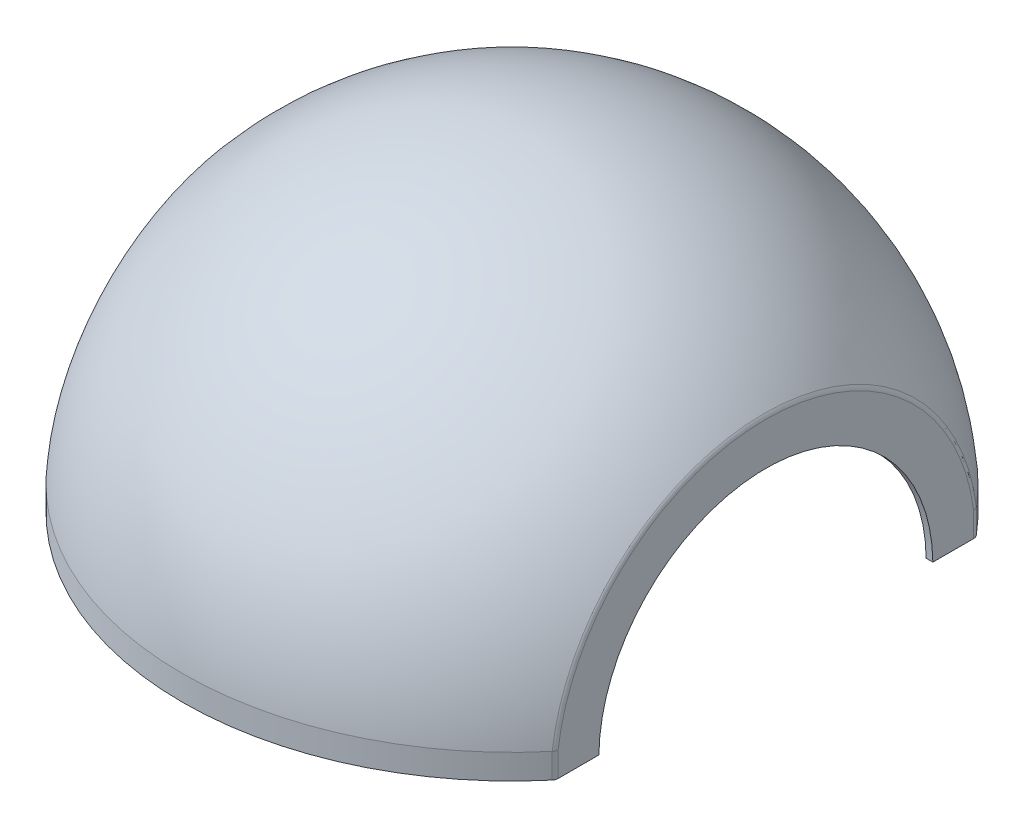
ISO-10303-21;
HEADER;
FILE_DESCRIPTION(('STEP AP214'),'2;1');
FILE_NAME('part.step','',(''),(''),'','','');
FILE_SCHEMA(('AUTOMOTIVE_DESIGN { 1 0 10303 214 1 1 1 1 }'));
ENDSEC;
DATA;
#1=APPLICATION_CONTEXT('core data for automotive mechanical design processes');
#2=APPLICATION_PROTOCOL_DEFINITION('international standard','automotive_design',2000,#1);
#3=PRODUCT_CONTEXT('',#1,'mechanical');
#4=PRODUCT('Part','Part','',(#3));
#5=PRODUCT_RELATED_PRODUCT_CATEGORY('part','',(#4));
#6=PRODUCT_DEFINITION_FORMATION('','',#4);
#7=PRODUCT_DEFINITION_CONTEXT('part definition',#1,'design');
#8=PRODUCT_DEFINITION('design','',#6,#7);
#9=PRODUCT_DEFINITION_SHAPE('','',#8);
#10=(LENGTH_UNIT() NAMED_UNIT(*) SI_UNIT(.MILLI.,.METRE.));
#11=(NAMED_UNIT(*) PLANE_ANGLE_UNIT() SI_UNIT($,.RADIAN.));
#12=(NAMED_UNIT(*) SI_UNIT($,.STERADIAN.) SOLID_ANGLE_UNIT());
#13=UNCERTAINTY_MEASURE_WITH_UNIT(LENGTH_MEASURE(1.E-05),#10,'distance_accuracy_value','');
#14=(GEOMETRIC_REPRESENTATION_CONTEXT(3) GLOBAL_UNCERTAINTY_ASSIGNED_CONTEXT((#13)) GLOBAL_UNIT_ASSIGNED_CONTEXT((#10,
#11,#12)) REPRESENTATION_CONTEXT('',''));
#15=CARTESIAN_POINT('',(0.,0.,0.));
#16=DIRECTION('',(0.,0.,1.));
#17=DIRECTION('',(1.,0.,0.));
#18=AXIS2_PLACEMENT_3D('',#15,#16,#17);
#19=CARTESIAN_POINT('',(145.,1.,0.));
#20=DIRECTION('',(0.,-1.,0.));
#21=DIRECTION('',(0.,0.,-1.));
#22=AXIS2_PLACEMENT_3D('',#19,#20,#21);
#23=PLANE('',#22);
#24=DIRECTION('',(0.,0.,1.));
#25=VECTOR('',#24,1.);
#26=CARTESIAN_POINT('',(114.,1.,0.));
#27=LINE('',#26,#25);
#28=CARTESIAN_POINT('',(114.,1.00000000000001,74.9933330370107));
#29=VERTEX_POINT('',#28);
#30=CARTESIAN_POINT('',(114.,1.,93.2952303175248));
#31=VERTEX_POINT('',#30);
#32=EDGE_CURVE('E289',#29,#31,#27,.T.);
#33=ORIENTED_EDGE('',*,*,#32,.T.);
#34=CARTESIAN_POINT('',(111.,1.,93.2952303175248));
#35=DIRECTION('',(0.,-1.,0.));
#36=DIRECTION('',(0.,0.,-1.));
#37=AXIS2_PLACEMENT_3D('',#34,#35,#36);
#38=CIRCLE('',#37,3.);
#39=CARTESIAN_POINT('',(113.296551724138,1.,95.2254764620253));
#40=VERTEX_POINT('',#39);
#41=EDGE_CURVE('E408',#31,#40,#38,.T.);
#42=ORIENTED_EDGE('',*,*,#41,.T.);
#43=CARTESIAN_POINT('',(0.,1.,0.));
#44=DIRECTION('',(0.,-1.,0.));
#45=DIRECTION('',(0.,0.,-1.));
#46=AXIS2_PLACEMENT_3D('',#43,#44,#45);
#47=CIRCLE('',#46,148.);
#48=CARTESIAN_POINT('',(-113.296551724138,1.,95.2254764620253));
#49=VERTEX_POINT('',#48);
#50=EDGE_CURVE('E303',#40,#49,#47,.T.);
#51=ORIENTED_EDGE('',*,*,#50,.T.);
#52=CARTESIAN_POINT('',(-111.,1.,93.2952303175248));
#53=DIRECTION('',(0.,-1.,0.));
#54=DIRECTION('',(0.,0.,-1.));
#55=AXIS2_PLACEMENT_3D('',#52,#53,#54);
#56=CIRCLE('',#55,3.);
#57=CARTESIAN_POINT('',(-114.,1.,93.2952303175248));
#58=VERTEX_POINT('',#57);
#59=EDGE_CURVE('E406',#49,#58,#56,.T.);
#60=ORIENTED_EDGE('',*,*,#59,.T.);
#61=DIRECTION('',(0.,0.,-1.));
#62=VECTOR('',#61,1.);
#63=CARTESIAN_POINT('',(-114.,1.,0.));
#64=LINE('',#63,#62);
#65=CARTESIAN_POINT('',(-114.,0.99999999999999,74.9933330370107));
#66=VERTEX_POINT('',#65);
#67=EDGE_CURVE('E180',#58,#66,#64,.T.);
#68=ORIENTED_EDGE('',*,*,#67,.T.);
#69=DIRECTION('',(-1.,0.,0.));
#70=VECTOR('',#69,1.);
#71=CARTESIAN_POINT('',(-111.,0.99999999999999,74.9933330370107));
#72=LINE('',#71,#70);
#73=CARTESIAN_POINT('',(-111.,0.99999999999999,74.9933330370107));
#74=VERTEX_POINT('',#73);
#75=EDGE_CURVE('E175',#74,#66,#72,.T.);
#76=ORIENTED_EDGE('',*,*,#75,.F.);
#77=DIRECTION('',(0.,0.,1.));
#78=VECTOR('',#77,1.);
#79=CARTESIAN_POINT('',(-111.,0.99999999999999,74.9933330370107));
#80=LINE('',#79,#78);
#81=CARTESIAN_POINT('',(-111.,1.,93.2952303175248));
#82=VERTEX_POINT('',#81);
#83=EDGE_CURVE('E179',#74,#82,#80,.T.);
#84=ORIENTED_EDGE('',*,*,#83,.T.);
#85=CARTESIAN_POINT('',(0.,1.,0.));
#86=DIRECTION('',(0.,-1.,0.));
#87=DIRECTION('',(0.,0.,-1.));
#88=AXIS2_PLACEMENT_3D('',#85,#86,#87);
#89=CIRCLE('',#88,145.);
#90=CARTESIAN_POINT('',(111.,1.,93.2952303175248));
#91=VERTEX_POINT('',#90);
#92=EDGE_CURVE('E294',#91,#82,#89,.T.);
#93=ORIENTED_EDGE('',*,*,#92,.F.);
#94=DIRECTION('',(0.,0.,-1.));
#95=VECTOR('',#94,1.);
#96=CARTESIAN_POINT('',(111.,1.00000000000001,93.9946807005588));
#97=LINE('',#96,#95);
#98=CARTESIAN_POINT('',(111.,1.00000000000001,74.9933330370107));
#99=VERTEX_POINT('',#98);
#100=EDGE_CURVE('E251',#91,#99,#97,.T.);
#101=ORIENTED_EDGE('',*,*,#100,.T.);
#102=DIRECTION('',(1.,0.,0.));
#103=VECTOR('',#102,1.);
#104=CARTESIAN_POINT('',(111.,1.00000000000001,74.9933330370107));
#105=LINE('',#104,#103);
#106=EDGE_CURVE('E256',#99,#29,#105,.T.);
#107=ORIENTED_EDGE('',*,*,#106,.T.);
#108=EDGE_LOOP('',(#33,#42,#51,#60,#68,#76,#84,#93,#101,#107));
#109=FACE_BOUND('',#108,.T.);
#110=ADVANCED_FACE('F36',(#109),#23,.T.);
#111=CARTESIAN_POINT('',(-113.296551724138,1.,-95.2254764620253));
#112=VERTEX_POINT('',#111);
#113=CARTESIAN_POINT('',(113.296551724138,1.,-95.2254764620253));
#114=VERTEX_POINT('',#113);
#115=EDGE_CURVE('E301',#112,#114,#47,.T.);
#116=ORIENTED_EDGE('',*,*,#115,.T.);
#117=CARTESIAN_POINT('',(111.,1.,-93.2952303175248));
#118=DIRECTION('',(0.,-1.,0.));
#119=DIRECTION('',(0.,0.,-1.));
#120=AXIS2_PLACEMENT_3D('',#117,#118,#119);
#121=CIRCLE('',#120,3.);
#122=CARTESIAN_POINT('',(114.,1.,-93.2952303175248));
#123=VERTEX_POINT('',#122);
#124=EDGE_CURVE('E409',#114,#123,#121,.T.);
#125=ORIENTED_EDGE('',*,*,#124,.T.);
#126=CARTESIAN_POINT('',(114.,1.00000000000001,-74.9933330370107));
#127=VERTEX_POINT('',#126);
#128=EDGE_CURVE('E287',#123,#127,#27,.T.);
#129=ORIENTED_EDGE('',*,*,#128,.T.);
#130=DIRECTION('',(1.,0.,0.));
#131=VECTOR('',#130,1.);
#132=CARTESIAN_POINT('',(111.,1.00000000000001,-74.9933330370107));
#133=LINE('',#132,#131);
#134=CARTESIAN_POINT('',(111.,1.00000000000001,-74.9933330370107));
#135=VERTEX_POINT('',#134);
#136=EDGE_CURVE('E253',#135,#127,#133,.T.);
#137=ORIENTED_EDGE('',*,*,#136,.F.);
#138=DIRECTION('',(0.,0.,-1.));
#139=VECTOR('',#138,1.);
#140=CARTESIAN_POINT('',(111.,1.00000000000001,-74.9933330370107));
#141=LINE('',#140,#139);
#142=CARTESIAN_POINT('',(111.,1.,-93.2952303175248));
#143=VERTEX_POINT('',#142);
#144=EDGE_CURVE('E245',#135,#143,#141,.T.);
#145=ORIENTED_EDGE('',*,*,#144,.T.);
#146=CARTESIAN_POINT('',(-111.,1.,-93.2952303175248));
#147=VERTEX_POINT('',#146);
#148=EDGE_CURVE('E292',#147,#143,#89,.T.);
#149=ORIENTED_EDGE('',*,*,#148,.F.);
#150=DIRECTION('',(0.,0.,1.));
#151=VECTOR('',#150,1.);
#152=CARTESIAN_POINT('',(-111.,0.99999999999999,-93.9946807005588));
#153=LINE('',#152,#151);
#154=CARTESIAN_POINT('',(-111.,0.99999999999999,-74.9933330370107));
#155=VERTEX_POINT('',#154);
#156=EDGE_CURVE('E186',#147,#155,#153,.T.);
#157=ORIENTED_EDGE('',*,*,#156,.T.);
#158=DIRECTION('',(-1.,0.,0.));
#159=VECTOR('',#158,1.);
#160=CARTESIAN_POINT('',(-111.,0.99999999999999,-74.9933330370107));
#161=LINE('',#160,#159);
#162=CARTESIAN_POINT('',(-114.,0.99999999999999,-74.9933330370107));
#163=VERTEX_POINT('',#162);
#164=EDGE_CURVE('E185',#155,#163,#161,.T.);
#165=ORIENTED_EDGE('',*,*,#164,.T.);
#166=CARTESIAN_POINT('',(-114.,1.,-93.2952303175248));
#167=VERTEX_POINT('',#166);
#168=EDGE_CURVE('E291',#163,#167,#64,.T.);
#169=ORIENTED_EDGE('',*,*,#168,.T.);
#170=CARTESIAN_POINT('',(-111.,1.,-93.2952303175248));
#171=DIRECTION('',(0.,-1.,0.));
#172=DIRECTION('',(0.,0.,-1.));
#173=AXIS2_PLACEMENT_3D('',#170,#171,#172);
#174=CIRCLE('',#173,3.);
#175=EDGE_CURVE('E362',#167,#112,#174,.T.);
#176=ORIENTED_EDGE('',*,*,#175,.T.);
#177=EDGE_LOOP('',(#116,#125,#129,#137,#145,#149,#157,#165,#169,#176));
#178=FACE_BOUND('',#177,.T.);
#179=ADVANCED_FACE('F423',(#178),#23,.T.);
#180=CARTESIAN_POINT('',(0.,0.,0.));
#181=DIRECTION('',(0.,-1.,0.));
#182=DIRECTION('',(0.,0.,-1.));
#183=AXIS2_PLACEMENT_3D('',#180,#181,#182);
#184=CYLINDRICAL_SURFACE('',#183,148.);
#185=CARTESIAN_POINT('',(0.,12.1757956618859,0.));
#186=DIRECTION('',(0.,-1.,0.));
#187=DIRECTION('',(0.,0.,-1.));
#188=AXIS2_PLACEMENT_3D('',#185,#186,#187);
#189=CIRCLE('',#188,148.);
#190=CARTESIAN_POINT('',(-113.288659793814,12.1757956618859,-95.234865265413));
#191=VERTEX_POINT('',#190);
#192=CARTESIAN_POINT('',(113.288659793819,12.1757956618859,-95.234865265407));
#193=VERTEX_POINT('',#192);
#194=EDGE_CURVE('E302',#191,#193,#189,.T.);
#195=ORIENTED_EDGE('',*,*,#194,.T.);
#196=CARTESIAN_POINT('',(113.288659793819,12.1757956618859,-95.234865265407));
#197=CARTESIAN_POINT('',(113.289975959251,12.1757957506517,-95.2332995927424));
#198=CARTESIAN_POINT('',(113.291291702827,12.1757709454617,-95.2317343561283));
#199=CARTESIAN_POINT('',(113.293922346267,12.17567154717,-95.2286047550011));
#200=CARTESIAN_POINT('',(113.29523724613,12.1755969540684,-95.227040390488));
#201=CARTESIAN_POINT('',(113.296551724138,12.1754974670109,-95.2254764620253));
#202=B_SPLINE_CURVE_WITH_KNOTS('',3,(#196,#197,#198,#199,#200,#201),.UNSPECIFIED.,.F.,.F.,(4,2,
4),(0.,0.00613480717022669,0.0122696143399743),.UNSPECIFIED.);
#203=CARTESIAN_POINT('',(113.296551724138,12.1754974670111,-95.2254764620253));
#204=VERTEX_POINT('',#203);
#205=EDGE_CURVE('E384',#193,#204,#202,.T.);
#206=ORIENTED_EDGE('',*,*,#205,.T.);
#207=DIRECTION('',(0.,-1.,0.));
#208=VECTOR('',#207,1.);
#209=CARTESIAN_POINT('',(113.296551724138,0.,-95.2254764620253));
#210=LINE('',#209,#208);
#211=EDGE_CURVE('E323',#204,#114,#210,.T.);
#212=ORIENTED_EDGE('',*,*,#211,.T.);
#213=ORIENTED_EDGE('',*,*,#115,.F.);
#214=DIRECTION('',(0.,-1.,0.));
#215=VECTOR('',#214,1.);
#216=CARTESIAN_POINT('',(-113.296551724138,0.,-95.2254764620253));
#217=LINE('',#216,#215);
#218=CARTESIAN_POINT('',(-113.296551724138,12.175497467011,-95.2254764620253));
#219=VERTEX_POINT('',#218);
#220=EDGE_CURVE('E315',#112,#219,#217,.F.);
#221=ORIENTED_EDGE('',*,*,#220,.T.);
#222=CARTESIAN_POINT('',(-113.296551724138,12.175497467011,-95.2254764620253));
#223=CARTESIAN_POINT('',(-113.295237246129,12.1755969540685,-95.227040390489));
#224=CARTESIAN_POINT('',(-113.293922346265,12.1756715471702,-95.2286047550031));
#225=CARTESIAN_POINT('',(-113.291291702824,12.1757709454619,-95.2317343561323));
#226=CARTESIAN_POINT('',(-113.289975959247,12.1757957506519,-95.2332995927474));
#227=CARTESIAN_POINT('',(-113.288659793814,12.1757956618862,-95.234865265413));
#228=B_SPLINE_CURVE_WITH_KNOTS('',3,(#222,#223,#224,#225,#226,#227),.UNSPECIFIED.,.F.,.F.,(4,2,
4),(0.,0.00613480717365093,0.0122696143477866),.UNSPECIFIED.);
#229=EDGE_CURVE('E317',#219,#191,#228,.T.);
#230=ORIENTED_EDGE('',*,*,#229,.T.);
#231=EDGE_LOOP('',(#195,#206,#212,#213,#221,#230));
#232=FACE_BOUND('',#231,.T.);
#233=ADVANCED_FACE('F325',(#232),#184,.T.);
#234=DIRECTION('',(0.,-1.,0.));
#235=VECTOR('',#234,1.);
#236=CARTESIAN_POINT('',(113.296551724138,0.,95.2254764620253));
#237=LINE('',#236,#235);
#238=CARTESIAN_POINT('',(113.296551724138,12.1754974670111,95.2254764620253));
#239=VERTEX_POINT('',#238);
#240=EDGE_CURVE('E352',#40,#239,#237,.F.);
#241=ORIENTED_EDGE('',*,*,#240,.T.);
#242=CARTESIAN_POINT('',(113.296551724138,12.1754974670111,95.2254764620253));
#243=CARTESIAN_POINT('',(113.295237246129,12.1755969540684,95.227040390489));
#244=CARTESIAN_POINT('',(113.293922346265,12.1756715471699,95.2286047550031));
#245=CARTESIAN_POINT('',(113.291291702824,12.1757709454615,95.2317343561323));
#246=CARTESIAN_POINT('',(113.289975959247,12.1757957506516,95.2332995927475));
#247=CARTESIAN_POINT('',(113.288659793814,12.175795661886,95.234865265413));
#248=B_SPLINE_CURVE_WITH_KNOTS('',3,(#242,#243,#244,#245,#246,#247),.UNSPECIFIED.,.F.,.F.,(4,2,
4),(0.,0.00613480717366456,0.0122696143477914),.UNSPECIFIED.);
#249=CARTESIAN_POINT('',(113.288659793814,12.1757956618859,95.234865265413));
#250=VERTEX_POINT('',#249);
#251=EDGE_CURVE('E356',#239,#250,#248,.T.);
#252=ORIENTED_EDGE('',*,*,#251,.T.);
#253=CARTESIAN_POINT('',(-113.288659793819,12.1757956618859,95.234865265407));
#254=VERTEX_POINT('',#253);
#255=EDGE_CURVE('E298',#250,#254,#189,.T.);
#256=ORIENTED_EDGE('',*,*,#255,.T.);
#257=CARTESIAN_POINT('',(-113.288659793819,12.1757956618859,95.234865265407));
#258=CARTESIAN_POINT('',(-113.289975959251,12.1757957506517,95.2332995927424));
#259=CARTESIAN_POINT('',(-113.291291702827,12.1757709454617,95.2317343561283));
#260=CARTESIAN_POINT('',(-113.293922346267,12.17567154717,95.2286047550011));
#261=CARTESIAN_POINT('',(-113.29523724613,12.1755969540684,95.227040390488));
#262=CARTESIAN_POINT('',(-113.296551724138,12.175497467011,95.2254764620253));
#263=B_SPLINE_CURVE_WITH_KNOTS('',3,(#257,#258,#259,#260,#261,#262),.UNSPECIFIED.,.F.,.F.,(4,2,
4),(0.,0.00613480717021556,0.0122696143399634),.UNSPECIFIED.);
#264=CARTESIAN_POINT('',(-113.296551724138,12.175497467011,95.2254764620253));
#265=VERTEX_POINT('',#264);
#266=EDGE_CURVE('E346',#254,#265,#263,.T.);
#267=ORIENTED_EDGE('',*,*,#266,.T.);
#268=DIRECTION('',(0.,-1.,0.));
#269=VECTOR('',#268,1.);
#270=CARTESIAN_POINT('',(-113.296551724138,0.,95.2254764620253));
#271=LINE('',#270,#269);
#272=EDGE_CURVE('E353',#265,#49,#271,.T.);
#273=ORIENTED_EDGE('',*,*,#272,.T.);
#274=ORIENTED_EDGE('',*,*,#50,.F.);
#275=EDGE_LOOP('',(#241,#252,#256,#267,#273,#274));
#276=FACE_BOUND('',#275,.T.);
#277=ADVANCED_FACE('F400',(#276),#184,.T.);
#278=CARTESIAN_POINT('',(0.,0.,0.));
#279=DIRECTION('',(0.,-1.,0.));
#280=DIRECTION('',(1.,0.,0.));
#281=AXIS2_PLACEMENT_3D('',#278,#279,#280);
#282=SPHERICAL_SURFACE('',#281,148.5);
#283=ORIENTED_EDGE('',*,*,#255,.F.);
#284=CARTESIAN_POINT('',(113.288659793814,0.,0.));
#285=DIRECTION('',(-1.,0.,0.));
#286=DIRECTION('',(0.,-1.,0.));
#287=AXIS2_PLACEMENT_3D('',#284,#285,#286);
#288=CIRCLE('',#287,96.0100492767365);
#289=EDGE_CURVE('E312',#250,#193,#288,.T.);
#290=ORIENTED_EDGE('',*,*,#289,.T.);
#291=ORIENTED_EDGE('',*,*,#194,.F.);
#292=CARTESIAN_POINT('',(-113.288659793814,0.,0.));
#293=DIRECTION('',(1.,0.,0.));
#294=DIRECTION('',(0.,1.,0.));
#295=AXIS2_PLACEMENT_3D('',#292,#293,#294);
#296=CIRCLE('',#295,96.0100492767365);
#297=EDGE_CURVE('E309',#191,#254,#296,.T.);
#298=ORIENTED_EDGE('',*,*,#297,.T.);
#299=EDGE_LOOP('',(#283,#290,#291,#298));
#300=FACE_BOUND('',#299,.T.);
#301=ADVANCED_FACE('F439',(#300),#282,.T.);
#302=CARTESIAN_POINT('',(0.,0.,0.));
#303=DIRECTION('',(0.,-1.,0.));
#304=DIRECTION('',(-1.,0.,0.));
#305=AXIS2_PLACEMENT_3D('',#302,#303,#304);
#306=SPHERICAL_SURFACE('',#305,145.5);
#307=CARTESIAN_POINT('',(-111.059668647084,0.,0.));
#308=DIRECTION('',(1.,0.,0.));
#309=DIRECTION('',(0.,1.,0.));
#310=AXIS2_PLACEMENT_3D('',#307,#308,#309);
#311=CIRCLE('',#310,94.);
#312=CARTESIAN_POINT('',(-111.059668647084,12.051970793194,-93.2241921391652));
#313=VERTEX_POINT('',#312);
#314=CARTESIAN_POINT('',(-111.059668647084,12.051970793194,93.2241921391652));
#315=VERTEX_POINT('',#314);
#316=EDGE_CURVE('E219',#313,#315,#311,.T.);
#317=ORIENTED_EDGE('',*,*,#316,.F.);
#318=CARTESIAN_POINT('',(0.,12.051970793194,0.));
#319=DIRECTION('',(0.,-1.,0.));
#320=DIRECTION('',(0.,0.,-1.));
#321=AXIS2_PLACEMENT_3D('',#318,#319,#320);
#322=CIRCLE('',#321,145.);
#323=CARTESIAN_POINT('',(111.059668647084,12.051970793194,-93.2241921391652));
#324=VERTEX_POINT('',#323);
#325=EDGE_CURVE('E295',#313,#324,#322,.T.);
#326=ORIENTED_EDGE('',*,*,#325,.T.);
#327=CARTESIAN_POINT('',(111.059668647084,0.,0.));
#328=DIRECTION('',(-1.,0.,0.));
#329=DIRECTION('',(0.,-1.,0.));
#330=AXIS2_PLACEMENT_3D('',#327,#328,#329);
#331=CIRCLE('',#330,94.);
#332=CARTESIAN_POINT('',(111.059668647084,12.051970793194,93.2241921391652));
#333=VERTEX_POINT('',#332);
#334=EDGE_CURVE('E268',#333,#324,#331,.T.);
#335=ORIENTED_EDGE('',*,*,#334,.F.);
#336=EDGE_CURVE('E297',#333,#315,#322,.T.);
#337=ORIENTED_EDGE('',*,*,#336,.T.);
#338=EDGE_LOOP('',(#317,#326,#335,#337));
#339=FACE_BOUND('',#338,.T.);
#340=ADVANCED_FACE('F447',(#339),#306,.F.);
#341=CARTESIAN_POINT('',(0.,0.,0.));
#342=DIRECTION('',(0.,-1.,0.));
#343=DIRECTION('',(0.,0.,-1.));
#344=AXIS2_PLACEMENT_3D('',#341,#342,#343);
#345=CYLINDRICAL_SURFACE('',#344,145.);
#346=CARTESIAN_POINT('',(-111.,11.4891252930762,-93.2952303175248));
#347=CARTESIAN_POINT('',(-111.00971599462,11.5829924773327,-93.2836706834026));
#348=CARTESIAN_POINT('',(-111.019546379186,11.6768298611374,-93.2719710181449));
#349=CARTESIAN_POINT('',(-111.039435928214,11.8644450278433,-93.2482916253584));
#350=CARTESIAN_POINT('',(-111.049495092675,11.9582228107445,-93.2363118978296));
#351=CARTESIAN_POINT('',(-111.059668647084,12.0519707931939,-93.2241921391653));
#352=B_SPLINE_CURVE_WITH_KNOTS('',3,(#346,#347,#348,#349,#350,#351),.UNSPECIFIED.,.F.,.F.,(4,2,
4),(0.,0.285220544569754,0.570441089139504),.UNSPECIFIED.);
#353=CARTESIAN_POINT('',(-111.,11.4891252930762,-93.2952303175248));
#354=VERTEX_POINT('',#353);
#355=EDGE_CURVE('E233',#354,#313,#352,.T.);
#356=ORIENTED_EDGE('',*,*,#355,.F.);
#357=DIRECTION('',(0.,-1.,0.));
#358=VECTOR('',#357,1.);
#359=CARTESIAN_POINT('',(-111.,0.,-93.2952303175248));
#360=LINE('',#359,#358);
#361=EDGE_CURVE('E239',#354,#147,#360,.T.);
#362=ORIENTED_EDGE('',*,*,#361,.T.);
#363=ORIENTED_EDGE('',*,*,#148,.T.);
#364=DIRECTION('',(0.,-1.,0.));
#365=VECTOR('',#364,1.);
#366=CARTESIAN_POINT('',(111.,0.,-93.2952303175248));
#367=LINE('',#366,#365);
#368=CARTESIAN_POINT('',(111.,11.4891252930762,-93.2952303175248));
#369=VERTEX_POINT('',#368);
#370=EDGE_CURVE('E285',#143,#369,#367,.F.);
#371=ORIENTED_EDGE('',*,*,#370,.T.);
#372=CARTESIAN_POINT('',(114.,28.4077454226836,-89.6046873773911));
#373=CARTESIAN_POINT('',(113.660257440479,27.044641273684,-90.0368762603402));
#374=CARTESIAN_POINT('',(113.33998637383,25.6671133677272,-90.439329368361));
#375=CARTESIAN_POINT('',(112.743757415266,22.8906795166254,-91.1815416264126));
#376=CARTESIAN_POINT('',(112.467663842771,21.491854063938,-91.5214932335773));
#377=CARTESIAN_POINT('',(111.962962328555,18.6716363681203,-92.1382302669922));
#378=CARTESIAN_POINT('',(111.734357028271,17.2502428744205,-92.4150121796438));
#379=CARTESIAN_POINT('',(111.42967983211,15.102263993429,-92.7817423693542));
#380=CARTESIAN_POINT('',(111.334370132355,14.3824515988266,-92.8960567278873));
#381=CARTESIAN_POINT('',(111.157083846242,12.93873237106,-93.1081177050722));
#382=CARTESIAN_POINT('',(111.075107707008,12.2148254014311,-93.2058637681302));
#383=CARTESIAN_POINT('',(111.,11.4891252930762,-93.2952303175248));
#384=B_SPLINE_CURVE_WITH_KNOTS('',3,(#372,#373,#374,#375,#376,#377,#378,#379,#380,#381,#382,
#383),.UNSPECIFIED.,.F.,.F.,(4,2,2,2,2,4),(0.,4.40902732189413,8.80424209043425,
13.1997012682419,15.4045392610895,17.609451175364),.UNSPECIFIED.);
#385=EDGE_CURVE('E279',#324,#369,#384,.T.);
#386=ORIENTED_EDGE('',*,*,#385,.F.);
#387=ORIENTED_EDGE('',*,*,#325,.F.);
#388=EDGE_LOOP('',(#356,#362,#363,#371,#386,#387));
#389=FACE_BOUND('',#388,.T.);
#390=ADVANCED_FACE('F221',(#389),#345,.F.);
#391=CARTESIAN_POINT('',(-114.,28.4077454226836,89.6046873773911));
#392=CARTESIAN_POINT('',(-113.660257440479,27.044641273684,90.0368762603402));
#393=CARTESIAN_POINT('',(-113.33998637383,25.6671133677271,90.439329368361));
#394=CARTESIAN_POINT('',(-112.743757415266,22.8906795166254,91.1815416264126));
#395=CARTESIAN_POINT('',(-112.467663842771,21.491854063938,91.5214932335773));
#396=CARTESIAN_POINT('',(-111.962962328555,18.6716363681203,92.1382302669922));
#397=CARTESIAN_POINT('',(-111.734357028271,17.2502428744205,92.4150121796438));
#398=CARTESIAN_POINT('',(-111.42967983211,15.102263993429,92.7817423693542));
#399=CARTESIAN_POINT('',(-111.334370132355,14.3824515988266,92.8960567278873));
#400=CARTESIAN_POINT('',(-111.157083846242,12.93873237106,93.1081177050722));
#401=CARTESIAN_POINT('',(-111.075107707008,12.2148254014311,93.2058637681302));
#402=CARTESIAN_POINT('',(-111.,11.4891252930762,93.2952303175248));
#403=B_SPLINE_CURVE_WITH_KNOTS('',3,(#391,#392,#393,#394,#395,#396,#397,#398,#399,#400,#401,
#402),.UNSPECIFIED.,.F.,.F.,(4,2,2,2,2,4),(0.,4.40902732189413,8.80424209043425,
13.1997012682419,15.4045392610895,17.609451175364),.UNSPECIFIED.);
#404=CARTESIAN_POINT('',(-111.,11.4891252930762,93.2952303175248));
#405=VERTEX_POINT('',#404);
#406=EDGE_CURVE('E210',#315,#405,#403,.T.);
#407=ORIENTED_EDGE('',*,*,#406,.F.);
#408=ORIENTED_EDGE('',*,*,#336,.F.);
#409=CARTESIAN_POINT('',(111.,11.4891252930762,93.2952303175248));
#410=CARTESIAN_POINT('',(111.00971599462,11.5829924773327,93.2836706834026));
#411=CARTESIAN_POINT('',(111.019546379186,11.6768298611374,93.2719710181449));
#412=CARTESIAN_POINT('',(111.039435928214,11.8644450278433,93.2482916253584));
#413=CARTESIAN_POINT('',(111.049495092675,11.9582228107445,93.2363118978296));
#414=CARTESIAN_POINT('',(111.059668647084,12.051970793194,93.2241921391653));
#415=B_SPLINE_CURVE_WITH_KNOTS('',3,(#409,#410,#411,#412,#413,#414),.UNSPECIFIED.,.F.,.F.,(4,2,
4),(0.,0.285220544569754,0.570441089139504),.UNSPECIFIED.);
#416=CARTESIAN_POINT('',(111.,11.4891252930762,93.2952303175248));
#417=VERTEX_POINT('',#416);
#418=EDGE_CURVE('E259',#417,#333,#415,.T.);
#419=ORIENTED_EDGE('',*,*,#418,.F.);
#420=DIRECTION('',(0.,-1.,0.));
#421=VECTOR('',#420,1.);
#422=CARTESIAN_POINT('',(111.,0.,93.2952303175248));
#423=LINE('',#422,#421);
#424=EDGE_CURVE('E306',#417,#91,#423,.T.);
#425=ORIENTED_EDGE('',*,*,#424,.T.);
#426=ORIENTED_EDGE('',*,*,#92,.T.);
#427=DIRECTION('',(0.,-1.,0.));
#428=VECTOR('',#427,1.);
#429=CARTESIAN_POINT('',(-111.,0.,93.2952303175248));
#430=LINE('',#429,#428);
#431=EDGE_CURVE('E196',#82,#405,#430,.F.);
#432=ORIENTED_EDGE('',*,*,#431,.T.);
#433=EDGE_LOOP('',(#407,#408,#419,#425,#426,#432));
#434=FACE_BOUND('',#433,.T.);
#435=ADVANCED_FACE('F461',(#434),#345,.F.);
#436=CARTESIAN_POINT('',(114.,150.,-150.));
#437=DIRECTION('',(1.,0.,0.));
#438=DIRECTION('',(0.,1.,0.));
#439=AXIS2_PLACEMENT_3D('',#436,#437,#438);
#440=PLANE('',#439);
#441=ORIENTED_EDGE('',*,*,#128,.F.);
#442=DIRECTION('',(0.,-1.,0.));
#443=VECTOR('',#442,1.);
#444=CARTESIAN_POINT('',(114.,150.,-93.2952303175248));
#445=LINE('',#444,#443);
#446=CARTESIAN_POINT('',(114.,12.0519707931941,-93.2952303175248));
#447=VERTEX_POINT('',#446);
#448=EDGE_CURVE('E392',#123,#447,#445,.F.);
#449=ORIENTED_EDGE('',*,*,#448,.T.);
#450=CARTESIAN_POINT('',(114.,0.,0.));
#451=DIRECTION('',(1.,0.,0.));
#452=DIRECTION('',(0.,1.,0.));
#453=AXIS2_PLACEMENT_3D('',#450,#451,#452);
#454=CIRCLE('',#453,94.0704523216509);
#455=CARTESIAN_POINT('',(114.,12.051970793194,93.2952303175248));
#456=VERTEX_POINT('',#455);
#457=EDGE_CURVE('E391',#447,#456,#454,.T.);
#458=ORIENTED_EDGE('',*,*,#457,.T.);
#459=DIRECTION('',(0.,-1.,0.));
#460=VECTOR('',#459,1.);
#461=CARTESIAN_POINT('',(114.,150.,93.2952303175248));
#462=LINE('',#461,#460);
#463=EDGE_CURVE('E389',#456,#31,#462,.T.);
#464=ORIENTED_EDGE('',*,*,#463,.T.);
#465=ORIENTED_EDGE('',*,*,#32,.F.);
#466=CARTESIAN_POINT('',(114.,0.,0.));
#467=DIRECTION('',(-1.,0.,0.));
#468=DIRECTION('',(0.,1.,0.));
#469=AXIS2_PLACEMENT_3D('',#466,#467,#468);
#470=CIRCLE('',#469,75.);
#471=EDGE_CURVE('E241',#29,#127,#470,.T.);
#472=ORIENTED_EDGE('',*,*,#471,.T.);
#473=EDGE_LOOP('',(#441,#449,#458,#464,#465,#472));
#474=FACE_BOUND('',#473,.T.);
#475=ADVANCED_FACE('F467',(#474),#440,.T.);
#476=CARTESIAN_POINT('',(-114.,150.,-150.));
#477=DIRECTION('',(-1.,0.,0.));
#478=DIRECTION('',(0.,-1.,0.));
#479=AXIS2_PLACEMENT_3D('',#476,#477,#478);
#480=PLANE('',#479);
#481=ORIENTED_EDGE('',*,*,#67,.F.);
#482=DIRECTION('',(0.,-1.,0.));
#483=VECTOR('',#482,1.);
#484=CARTESIAN_POINT('',(-114.,150.,93.2952303175248));
#485=LINE('',#484,#483);
#486=CARTESIAN_POINT('',(-114.,12.051970793194,93.2952303175248));
#487=VERTEX_POINT('',#486);
#488=EDGE_CURVE('E12',#58,#487,#485,.F.);
#489=ORIENTED_EDGE('',*,*,#488,.T.);
#490=CARTESIAN_POINT('',(-114.,0.,0.));
#491=DIRECTION('',(-1.,0.,0.));
#492=DIRECTION('',(0.,-1.,0.));
#493=AXIS2_PLACEMENT_3D('',#490,#491,#492);
#494=CIRCLE('',#493,94.0704523216509);
#495=CARTESIAN_POINT('',(-114.,12.051970793194,-93.2952303175248));
#496=VERTEX_POINT('',#495);
#497=EDGE_CURVE('E49',#487,#496,#494,.T.);
#498=ORIENTED_EDGE('',*,*,#497,.T.);
#499=DIRECTION('',(0.,-1.,0.));
#500=VECTOR('',#499,1.);
#501=CARTESIAN_POINT('',(-114.,150.,-93.2952303175248));
#502=LINE('',#501,#500);
#503=EDGE_CURVE('E411',#496,#167,#502,.T.);
#504=ORIENTED_EDGE('',*,*,#503,.T.);
#505=ORIENTED_EDGE('',*,*,#168,.F.);
#506=CARTESIAN_POINT('',(-114.,0.,0.));
#507=DIRECTION('',(1.,0.,0.));
#508=DIRECTION('',(0.,-1.,0.));
#509=AXIS2_PLACEMENT_3D('',#506,#507,#508);
#510=CIRCLE('',#509,75.);
#511=EDGE_CURVE('E202',#163,#66,#510,.T.);
#512=ORIENTED_EDGE('',*,*,#511,.T.);
#513=EDGE_LOOP('',(#481,#489,#498,#504,#505,#512));
#514=FACE_BOUND('',#513,.T.);
#515=ADVANCED_FACE('F416',(#514),#480,.T.);
#516=CARTESIAN_POINT('',(111.,0.,0.));
#517=DIRECTION('',(1.,0.,0.));
#518=DIRECTION('',(0.,1.,0.));
#519=AXIS2_PLACEMENT_3D('',#516,#517,#518);
#520=CYLINDRICAL_SURFACE('',#519,75.);
#521=ORIENTED_EDGE('',*,*,#471,.F.);
#522=ORIENTED_EDGE('',*,*,#106,.F.);
#523=CARTESIAN_POINT('',(111.,0.,0.));
#524=DIRECTION('',(-1.,0.,0.));
#525=DIRECTION('',(0.,1.,0.));
#526=AXIS2_PLACEMENT_3D('',#523,#524,#525);
#527=CIRCLE('',#526,75.);
#528=EDGE_CURVE('E242',#99,#135,#527,.T.);
#529=ORIENTED_EDGE('',*,*,#528,.T.);
#530=ORIENTED_EDGE('',*,*,#136,.T.);
#531=EDGE_LOOP('',(#521,#522,#529,#530));
#532=FACE_BOUND('',#531,.T.);
#533=ADVANCED_FACE('F275',(#532),#520,.F.);
#534=CARTESIAN_POINT('',(111.,0.,0.));
#535=DIRECTION('',(1.,0.,0.));
#536=DIRECTION('',(0.,1.,0.));
#537=AXIS2_PLACEMENT_3D('',#534,#535,#536);
#538=CYLINDRICAL_SURFACE('',#537,94.);
#539=ORIENTED_EDGE('',*,*,#334,.T.);
#540=ORIENTED_EDGE('',*,*,#385,.T.);
#541=CARTESIAN_POINT('',(111.,0.,0.));
#542=DIRECTION('',(1.,0.,0.));
#543=DIRECTION('',(0.,1.,0.));
#544=AXIS2_PLACEMENT_3D('',#541,#542,#543);
#545=CIRCLE('',#544,94.);
#546=EDGE_CURVE('E248',#369,#417,#545,.T.);
#547=ORIENTED_EDGE('',*,*,#546,.T.);
#548=ORIENTED_EDGE('',*,*,#418,.T.);
#549=EDGE_LOOP('',(#539,#540,#547,#548));
#550=FACE_BOUND('',#549,.T.);
#551=ADVANCED_FACE('F270',(#550),#538,.T.);
#552=CARTESIAN_POINT('',(111.,0.,0.));
#553=DIRECTION('',(1.,0.,0.));
#554=DIRECTION('',(0.,1.,0.));
#555=AXIS2_PLACEMENT_3D('',#552,#553,#554);
#556=PLANE('',#555);
#557=ORIENTED_EDGE('',*,*,#370,.F.);
#558=ORIENTED_EDGE('',*,*,#144,.F.);
#559=ORIENTED_EDGE('',*,*,#528,.F.);
#560=ORIENTED_EDGE('',*,*,#100,.F.);
#561=ORIENTED_EDGE('',*,*,#424,.F.);
#562=ORIENTED_EDGE('',*,*,#546,.F.);
#563=EDGE_LOOP('',(#557,#558,#559,#560,#561,#562));
#564=FACE_BOUND('',#563,.T.);
#565=ADVANCED_FACE('F274',(#564),#556,.F.);
#566=CARTESIAN_POINT('',(-111.,0.,0.));
#567=DIRECTION('',(-1.,0.,0.));
#568=DIRECTION('',(0.,-1.,0.));
#569=AXIS2_PLACEMENT_3D('',#566,#567,#568);
#570=CYLINDRICAL_SURFACE('',#569,75.);
#571=ORIENTED_EDGE('',*,*,#511,.F.);
#572=ORIENTED_EDGE('',*,*,#164,.F.);
#573=CARTESIAN_POINT('',(-111.,0.,0.));
#574=DIRECTION('',(1.,0.,0.));
#575=DIRECTION('',(0.,-1.,0.));
#576=AXIS2_PLACEMENT_3D('',#573,#574,#575);
#577=CIRCLE('',#576,75.);
#578=EDGE_CURVE('E194',#155,#74,#577,.T.);
#579=ORIENTED_EDGE('',*,*,#578,.T.);
#580=ORIENTED_EDGE('',*,*,#75,.T.);
#581=EDGE_LOOP('',(#571,#572,#579,#580));
#582=FACE_BOUND('',#581,.T.);
#583=ADVANCED_FACE('F200',(#582),#570,.F.);
#584=CARTESIAN_POINT('',(-111.,0.,0.));
#585=DIRECTION('',(-1.,0.,0.));
#586=DIRECTION('',(0.,-1.,0.));
#587=AXIS2_PLACEMENT_3D('',#584,#585,#586);
#588=CYLINDRICAL_SURFACE('',#587,94.);
#589=CARTESIAN_POINT('',(-111.,0.,0.));
#590=DIRECTION('',(-1.,0.,0.));
#591=DIRECTION('',(0.,-1.,0.));
#592=AXIS2_PLACEMENT_3D('',#589,#590,#591);
#593=CIRCLE('',#592,94.);
#594=EDGE_CURVE('E197',#405,#354,#593,.T.);
#595=ORIENTED_EDGE('',*,*,#594,.T.);
#596=ORIENTED_EDGE('',*,*,#355,.T.);
#597=ORIENTED_EDGE('',*,*,#316,.T.);
#598=ORIENTED_EDGE('',*,*,#406,.T.);
#599=EDGE_LOOP('',(#595,#596,#597,#598));
#600=FACE_BOUND('',#599,.T.);
#601=ADVANCED_FACE('F225',(#600),#588,.T.);
#602=CARTESIAN_POINT('',(-111.,0.,0.));
#603=DIRECTION('',(-1.,0.,0.));
#604=DIRECTION('',(0.,-1.,0.));
#605=AXIS2_PLACEMENT_3D('',#602,#603,#604);
#606=PLANE('',#605);
#607=ORIENTED_EDGE('',*,*,#361,.F.);
#608=ORIENTED_EDGE('',*,*,#594,.F.);
#609=ORIENTED_EDGE('',*,*,#431,.F.);
#610=ORIENTED_EDGE('',*,*,#83,.F.);
#611=ORIENTED_EDGE('',*,*,#578,.F.);
#612=ORIENTED_EDGE('',*,*,#156,.F.);
#613=EDGE_LOOP('',(#607,#608,#609,#610,#611,#612));
#614=FACE_BOUND('',#613,.T.);
#615=ADVANCED_FACE('F192',(#614),#606,.F.);
#616=CARTESIAN_POINT('',(111.,0.,93.2952303175248));
#617=DIRECTION('',(0.,-1.,0.));
#618=DIRECTION('',(0.,0.,-1.));
#619=AXIS2_PLACEMENT_3D('',#616,#617,#618);
#620=CYLINDRICAL_SURFACE('',#619,3.);
#621=ORIENTED_EDGE('',*,*,#41,.F.);
#622=ORIENTED_EDGE('',*,*,#463,.F.);
#623=CARTESIAN_POINT('',(113.296551724138,12.1754974670111,95.2254764620253));
#624=CARTESIAN_POINT('',(113.350849677009,12.1713850224073,95.1608869389899));
#625=CARTESIAN_POINT('',(113.402402699354,12.1671245147906,95.0940050944363));
#626=CARTESIAN_POINT('',(113.499687734033,12.1583381874931,94.9561534152429));
#627=CARTESIAN_POINT('',(113.545419936769,12.1538123764977,94.8851837144292));
#628=CARTESIAN_POINT('',(113.630845967799,12.144513989594,94.7394607210061));
#629=CARTESIAN_POINT('',(113.670523893432,12.1397408064726,94.6646981286524));
#630=CARTESIAN_POINT('',(113.743415159748,12.1299937667417,94.5121236428166));
#631=CARTESIAN_POINT('',(113.776628688367,12.125019915971,94.434311838062));
#632=CARTESIAN_POINT('',(113.868572248275,12.1094467389557,94.1908384719274));
#633=CARTESIAN_POINT('',(113.916228015895,12.0985614288248,94.0208712369062));
#634=CARTESIAN_POINT('',(113.980917169609,12.076429849926,93.6757897210322));
#635=CARTESIAN_POINT('',(113.99806000564,12.0651850191728,93.5006961359224));
#636=CARTESIAN_POINT('',(113.999948397789,12.0532803807607,93.3155906099527));
#637=CARTESIAN_POINT('',(114.000000234874,12.0526255763602,93.3054098778532));
#638=CARTESIAN_POINT('',(114.,12.051970793194,93.2952303175248));
#639=B_SPLINE_CURVE_WITH_KNOTS('',3,(#623,#624,#625,#626,#627,#628,#629,#630,#631,#632,#633,
#634,#635,#636,#637,#638),.UNSPECIFIED.,.F.,.F.,(4,2,2,2,2,2,2,4),(0.,0.253359336248534,
0.506710382864084,0.760715852182057,1.01471393579592,1.54243455077125,2.06825838695266,
2.09886348727191),.UNSPECIFIED.);
#640=EDGE_CURVE('E204',#239,#456,#639,.T.);
#641=ORIENTED_EDGE('',*,*,#640,.F.);
#642=ORIENTED_EDGE('',*,*,#240,.F.);
#643=EDGE_LOOP('',(#621,#622,#641,#642));
#644=FACE_BOUND('',#643,.T.);
#645=ADVANCED_FACE('F371',(#644),#620,.T.);
#646=CARTESIAN_POINT('',(111.,0.,-93.2952303175248));
#647=DIRECTION('',(0.,-1.,0.));
#648=DIRECTION('',(0.,0.,-1.));
#649=AXIS2_PLACEMENT_3D('',#646,#647,#648);
#650=CYLINDRICAL_SURFACE('',#649,3.);
#651=ORIENTED_EDGE('',*,*,#124,.F.);
#652=ORIENTED_EDGE('',*,*,#211,.F.);
#653=CARTESIAN_POINT('',(113.296551724138,12.1754974670111,-95.2254764620253));
#654=CARTESIAN_POINT('',(113.350849677009,12.1713850224072,-95.1608869389899));
#655=CARTESIAN_POINT('',(113.402402699354,12.1671245147905,-95.0940050944363));
#656=CARTESIAN_POINT('',(113.499687734033,12.1583381874932,-94.9561534152429));
#657=CARTESIAN_POINT('',(113.545419936769,12.1538123764978,-94.8851837144291));
#658=CARTESIAN_POINT('',(113.630845967799,12.144513989594,-94.739460721006));
#659=CARTESIAN_POINT('',(113.670523893432,12.1397408064726,-94.6646981286524));
#660=CARTESIAN_POINT('',(113.743415159748,12.1299937667416,-94.5121236428165));
#661=CARTESIAN_POINT('',(113.776628688368,12.125019915971,-94.434311838062));
#662=CARTESIAN_POINT('',(113.868572248276,12.1094467389557,-94.1908384719274));
#663=CARTESIAN_POINT('',(113.916228015895,12.0985614288247,-94.0208712369061));
#664=CARTESIAN_POINT('',(113.980917169609,12.076429849926,-93.6757897210322));
#665=CARTESIAN_POINT('',(113.99806000564,12.065185019173,-93.5006961359224));
#666=CARTESIAN_POINT('',(113.999948397789,12.0532803807606,-93.3155906099527));
#667=CARTESIAN_POINT('',(114.000000234874,12.0526255763601,-93.3054098778532));
#668=CARTESIAN_POINT('',(114.,12.051970793194,-93.2952303175248));
#669=B_SPLINE_CURVE_WITH_KNOTS('',3,(#653,#654,#655,#656,#657,#658,#659,#660,#661,#662,#663,
#664,#665,#666,#667,#668),.UNSPECIFIED.,.F.,.F.,(4,2,2,2,2,2,2,4),(0.,0.253359336248543,
0.506710382864103,0.76071585218207,1.01471393579593,1.54243455077127,2.06825838695265,
2.0988634872719),.UNSPECIFIED.);
#670=EDGE_CURVE('E376',#447,#204,#669,.F.);
#671=ORIENTED_EDGE('',*,*,#670,.F.);
#672=ORIENTED_EDGE('',*,*,#448,.F.);
#673=EDGE_LOOP('',(#651,#652,#671,#672));
#674=FACE_BOUND('',#673,.T.);
#675=ADVANCED_FACE('F368',(#674),#650,.T.);
#676=CARTESIAN_POINT('',(111.,0.,0.));
#677=DIRECTION('',(1.,0.,0.));
#678=DIRECTION('',(0.,1.,0.));
#679=AXIS2_PLACEMENT_3D('',#676,#677,#678);
#680=TOROIDAL_SURFACE('',#679,94.0704523216509,3.);
#681=ORIENTED_EDGE('',*,*,#640,.T.);
#682=ORIENTED_EDGE('',*,*,#457,.F.);
#683=ORIENTED_EDGE('',*,*,#670,.T.);
#684=ORIENTED_EDGE('',*,*,#205,.F.);
#685=ORIENTED_EDGE('',*,*,#289,.F.);
#686=ORIENTED_EDGE('',*,*,#251,.F.);
#687=EDGE_LOOP('',(#681,#682,#683,#684,#685,#686));
#688=FACE_BOUND('',#687,.T.);
#689=ADVANCED_FACE('F364',(#688),#680,.T.);
#690=CARTESIAN_POINT('',(-111.,0.,-93.2952303175248));
#691=DIRECTION('',(0.,-1.,0.));
#692=DIRECTION('',(0.,0.,-1.));
#693=AXIS2_PLACEMENT_3D('',#690,#691,#692);
#694=CYLINDRICAL_SURFACE('',#693,3.);
#695=ORIENTED_EDGE('',*,*,#175,.F.);
#696=ORIENTED_EDGE('',*,*,#503,.F.);
#697=CARTESIAN_POINT('',(-113.296551724138,12.175497467011,-95.2254764620253));
#698=CARTESIAN_POINT('',(-113.350849677009,12.1713850224071,-95.1608869389899));
#699=CARTESIAN_POINT('',(-113.402402699354,12.1671245147904,-95.0940050944363));
#700=CARTESIAN_POINT('',(-113.499687734033,12.1583381874931,-94.9561534152429));
#701=CARTESIAN_POINT('',(-113.545419936769,12.1538123764978,-94.8851837144291));
#702=CARTESIAN_POINT('',(-113.630845967799,12.144513989594,-94.739460721006));
#703=CARTESIAN_POINT('',(-113.670523893432,12.1397408064726,-94.6646981286524));
#704=CARTESIAN_POINT('',(-113.743415159748,12.1299937667417,-94.5121236428165));
#705=CARTESIAN_POINT('',(-113.776628688368,12.1250199159712,-94.434311838062));
#706=CARTESIAN_POINT('',(-113.868572248276,12.1094467389554,-94.1908384719274));
#707=CARTESIAN_POINT('',(-113.916228015895,12.098561428823,-94.0208712369062));
#708=CARTESIAN_POINT('',(-113.980917169609,12.076429849928,-93.6757897210321));
#709=CARTESIAN_POINT('',(-113.99806000564,12.0651850191802,-93.5006961359219));
#710=CARTESIAN_POINT('',(-113.999948397789,12.0532803807615,-93.3155906099527));
#711=CARTESIAN_POINT('',(-114.000000234874,12.0526255763606,-93.3054098778532));
#712=CARTESIAN_POINT('',(-114.,12.051970793194,-93.2952303175248));
#713=B_SPLINE_CURVE_WITH_KNOTS('',3,(#697,#698,#699,#700,#701,#702,#703,#704,#705,#706,#707,
#708,#709,#710,#711,#712),.UNSPECIFIED.,.F.,.F.,(4,2,2,2,2,2,2,4),(0.,0.253359336248521,
0.506710382864107,0.760715852182072,1.01471393579593,1.54243455077124,2.06825838695262,
2.09886348727188),.UNSPECIFIED.);
#714=EDGE_CURVE('E41',#219,#496,#713,.T.);
#715=ORIENTED_EDGE('',*,*,#714,.F.);
#716=ORIENTED_EDGE('',*,*,#220,.F.);
#717=EDGE_LOOP('',(#695,#696,#715,#716));
#718=FACE_BOUND('',#717,.T.);
#719=ADVANCED_FACE('F38',(#718),#694,.T.);
#720=CARTESIAN_POINT('',(-111.,0.,93.2952303175248));
#721=DIRECTION('',(0.,-1.,0.));
#722=DIRECTION('',(0.,0.,-1.));
#723=AXIS2_PLACEMENT_3D('',#720,#721,#722);
#724=CYLINDRICAL_SURFACE('',#723,3.);
#725=ORIENTED_EDGE('',*,*,#59,.F.);
#726=ORIENTED_EDGE('',*,*,#272,.F.);
#727=CARTESIAN_POINT('',(-113.296551724138,12.175497467011,95.2254764620253));
#728=CARTESIAN_POINT('',(-113.350849677009,12.1713850224072,95.1608869389899));
#729=CARTESIAN_POINT('',(-113.402402699354,12.1671245147905,95.0940050944363));
#730=CARTESIAN_POINT('',(-113.499687734033,12.1583381874932,94.9561534152429));
#731=CARTESIAN_POINT('',(-113.545419936769,12.1538123764977,94.8851837144291));
#732=CARTESIAN_POINT('',(-113.630845967799,12.144513989594,94.739460721006));
#733=CARTESIAN_POINT('',(-113.670523893432,12.1397408064726,94.6646981286524));
#734=CARTESIAN_POINT('',(-113.743415159748,12.1299937667417,94.5121236428165));
#735=CARTESIAN_POINT('',(-113.776628688368,12.1250199159712,94.434311838062));
#736=CARTESIAN_POINT('',(-113.868572248276,12.1094467389554,94.1908384719274));
#737=CARTESIAN_POINT('',(-113.916228015895,12.0985614288228,94.0208712369062));
#738=CARTESIAN_POINT('',(-113.980917169609,12.0764298499282,93.6757897210321));
#739=CARTESIAN_POINT('',(-113.99806000564,12.0651850191808,93.5006961359219));
#740=CARTESIAN_POINT('',(-113.999948397789,12.0532803807615,93.3155906099527));
#741=CARTESIAN_POINT('',(-114.000000234874,12.0526255763606,93.3054098778532));
#742=CARTESIAN_POINT('',(-114.,12.051970793194,93.2952303175248));
#743=B_SPLINE_CURVE_WITH_KNOTS('',3,(#727,#728,#729,#730,#731,#732,#733,#734,#735,#736,#737,
#738,#739,#740,#741,#742),.UNSPECIFIED.,.F.,.F.,(4,2,2,2,2,2,2,4),(0.,0.253359336248539,
0.506710382864099,0.760715852182073,1.01471393579593,1.54243455077127,2.06825838695266,
2.0988634872719),.UNSPECIFIED.);
#744=EDGE_CURVE('E339',#487,#265,#743,.F.);
#745=ORIENTED_EDGE('',*,*,#744,.F.);
#746=ORIENTED_EDGE('',*,*,#488,.F.);
#747=EDGE_LOOP('',(#725,#726,#745,#746));
#748=FACE_BOUND('',#747,.T.);
#749=ADVANCED_FACE('F333',(#748),#724,.T.);
#750=CARTESIAN_POINT('',(-111.,0.,0.));
#751=DIRECTION('',(-1.,0.,0.));
#752=DIRECTION('',(0.,-1.,0.));
#753=AXIS2_PLACEMENT_3D('',#750,#751,#752);
#754=TOROIDAL_SURFACE('',#753,94.0704523216509,3.);
#755=ORIENTED_EDGE('',*,*,#714,.T.);
#756=ORIENTED_EDGE('',*,*,#497,.F.);
#757=ORIENTED_EDGE('',*,*,#744,.T.);
#758=ORIENTED_EDGE('',*,*,#266,.F.);
#759=ORIENTED_EDGE('',*,*,#297,.F.);
#760=ORIENTED_EDGE('',*,*,#229,.F.);
#761=EDGE_LOOP('',(#755,#756,#757,#758,#759,#760));
#762=FACE_BOUND('',#761,.T.);
#763=ADVANCED_FACE('F329',(#762),#754,.T.);
#764=CLOSED_SHELL('',(#110,#179,#233,#277,#301,#340,#390,#435,#475,#515,#533,#551,#565,#583,
#601,#615,#645,#675,#689,#719,#749,#763));
#765=MANIFOLD_SOLID_BREP('B2',#764);
#766=ADVANCED_BREP_SHAPE_REPRESENTATION('',(#18,#765),#14);
#767=SHAPE_DEFINITION_REPRESENTATION(#9,#766);
ENDSEC;
END-ISO-10303-21;
